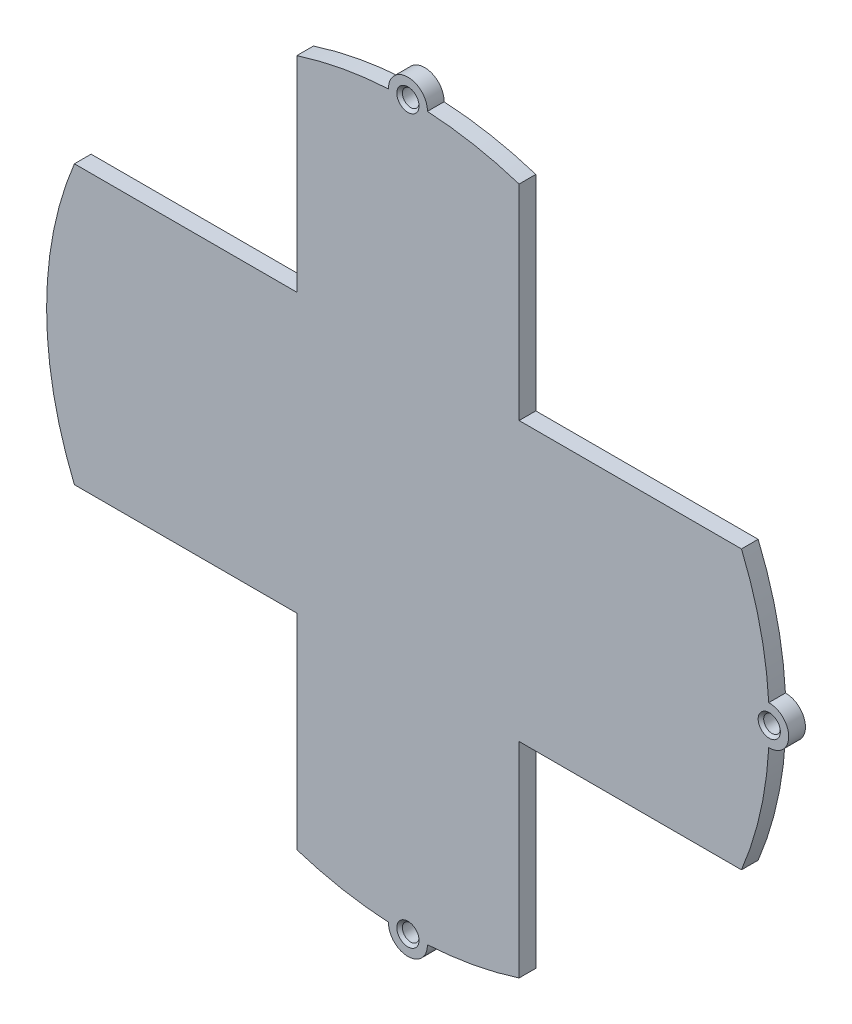
ISO-10303-21;
HEADER;
FILE_DESCRIPTION(('STEP AP214'),'2;1');
FILE_NAME('part.step','',(''),(''),'','','');
FILE_SCHEMA(('AUTOMOTIVE_DESIGN { 1 0 10303 214 1 1 1 1 }'));
ENDSEC;
DATA;
#1=APPLICATION_CONTEXT('core data for automotive mechanical design processes');
#2=APPLICATION_PROTOCOL_DEFINITION('international standard','automotive_design',2000,#1);
#3=PRODUCT_CONTEXT('',#1,'mechanical');
#4=PRODUCT('Part','Part','',(#3));
#5=PRODUCT_RELATED_PRODUCT_CATEGORY('part','',(#4));
#6=PRODUCT_DEFINITION_FORMATION('','',#4);
#7=PRODUCT_DEFINITION_CONTEXT('part definition',#1,'design');
#8=PRODUCT_DEFINITION('design','',#6,#7);
#9=PRODUCT_DEFINITION_SHAPE('','',#8);
#10=(LENGTH_UNIT() NAMED_UNIT(*) SI_UNIT(.MILLI.,.METRE.));
#11=(NAMED_UNIT(*) PLANE_ANGLE_UNIT() SI_UNIT($,.RADIAN.));
#12=(NAMED_UNIT(*) SI_UNIT($,.STERADIAN.) SOLID_ANGLE_UNIT());
#13=UNCERTAINTY_MEASURE_WITH_UNIT(LENGTH_MEASURE(1.E-05),#10,'distance_accuracy_value','');
#14=(GEOMETRIC_REPRESENTATION_CONTEXT(3) GLOBAL_UNCERTAINTY_ASSIGNED_CONTEXT((#13)) GLOBAL_UNIT_ASSIGNED_CONTEXT((#10,
#11,#12)) REPRESENTATION_CONTEXT('',''));
#15=CARTESIAN_POINT('',(0.,0.,0.));
#16=DIRECTION('',(0.,0.,1.));
#17=DIRECTION('',(1.,0.,0.));
#18=AXIS2_PLACEMENT_3D('',#15,#16,#17);
#19=CARTESIAN_POINT('',(0.,0.,3.));
#20=DIRECTION('',(0.,0.,-1.));
#21=DIRECTION('',(-1.,0.,0.));
#22=AXIS2_PLACEMENT_3D('',#19,#20,#21);
#23=CYLINDRICAL_SURFACE('',#22,65.);
#24=CARTESIAN_POINT('',(0.,0.,0.));
#25=DIRECTION('',(0.,0.,1.));
#26=DIRECTION('',(1.,0.,0.));
#27=AXIS2_PLACEMENT_3D('',#24,#25,#26);
#28=CIRCLE('',#27,65.);
#29=CARTESIAN_POINT('',(-20.,-61.8465843842649,0.));
#30=VERTEX_POINT('',#29);
#31=CARTESIAN_POINT('',(-3.4987312789253,-64.9057692307692,0.));
#32=VERTEX_POINT('',#31);
#33=EDGE_CURVE('E184',#30,#32,#28,.T.);
#34=ORIENTED_EDGE('',*,*,#33,.T.);
#35=DIRECTION('',(0.,0.,1.));
#36=VECTOR('',#35,1.);
#37=CARTESIAN_POINT('',(-3.4987312789253,-64.9057692307692,1.5));
#38=LINE('',#37,#36);
#39=CARTESIAN_POINT('',(-3.4987312789253,-64.9057692307692,3.));
#40=VERTEX_POINT('',#39);
#41=EDGE_CURVE('E167',#32,#40,#38,.T.);
#42=ORIENTED_EDGE('',*,*,#41,.T.);
#43=CARTESIAN_POINT('',(0.,0.,3.));
#44=DIRECTION('',(0.,0.,1.));
#45=DIRECTION('',(1.,0.,0.));
#46=AXIS2_PLACEMENT_3D('',#43,#44,#45);
#47=CIRCLE('',#46,65.);
#48=CARTESIAN_POINT('',(-20.,-61.8465843842649,3.));
#49=VERTEX_POINT('',#48);
#50=EDGE_CURVE('E355',#49,#40,#47,.T.);
#51=ORIENTED_EDGE('',*,*,#50,.F.);
#52=DIRECTION('',(0.,0.,-1.));
#53=VECTOR('',#52,1.);
#54=CARTESIAN_POINT('',(-20.,-61.8465843842649,3.));
#55=LINE('',#54,#53);
#56=EDGE_CURVE('E238',#49,#30,#55,.T.);
#57=ORIENTED_EDGE('',*,*,#56,.T.);
#58=EDGE_LOOP('',(#34,#42,#51,#57));
#59=FACE_BOUND('',#58,.T.);
#60=ADVANCED_FACE('F37',(#59),#23,.T.);
#61=CARTESIAN_POINT('',(0.,0.,3.));
#62=DIRECTION('',(0.,0.,-1.));
#63=DIRECTION('',(-1.,0.,0.));
#64=AXIS2_PLACEMENT_3D('',#61,#62,#63);
#65=CYLINDRICAL_SURFACE('',#64,65.);
#66=CARTESIAN_POINT('',(0.,0.,0.));
#67=DIRECTION('',(0.,0.,1.));
#68=DIRECTION('',(1.,0.,0.));
#69=AXIS2_PLACEMENT_3D('',#66,#67,#68);
#70=CIRCLE('',#69,65.);
#71=CARTESIAN_POINT('',(20.,61.8465843842649,0.));
#72=VERTEX_POINT('',#71);
#73=CARTESIAN_POINT('',(3.49873127892529,64.9057692307692,0.));
#74=VERTEX_POINT('',#73);
#75=EDGE_CURVE('E203',#72,#74,#70,.T.);
#76=ORIENTED_EDGE('',*,*,#75,.T.);
#77=DIRECTION('',(0.,0.,1.));
#78=VECTOR('',#77,1.);
#79=CARTESIAN_POINT('',(3.49873127892529,64.9057692307692,1.5));
#80=LINE('',#79,#78);
#81=CARTESIAN_POINT('',(3.49873127892529,64.9057692307692,3.));
#82=VERTEX_POINT('',#81);
#83=EDGE_CURVE('E368',#74,#82,#80,.T.);
#84=ORIENTED_EDGE('',*,*,#83,.T.);
#85=CARTESIAN_POINT('',(0.,0.,3.));
#86=DIRECTION('',(0.,0.,1.));
#87=DIRECTION('',(1.,0.,0.));
#88=AXIS2_PLACEMENT_3D('',#85,#86,#87);
#89=CIRCLE('',#88,65.);
#90=CARTESIAN_POINT('',(20.,61.8465843842649,3.));
#91=VERTEX_POINT('',#90);
#92=EDGE_CURVE('E340',#91,#82,#89,.T.);
#93=ORIENTED_EDGE('',*,*,#92,.F.);
#94=DIRECTION('',(0.,0.,-1.));
#95=VECTOR('',#94,1.);
#96=CARTESIAN_POINT('',(20.,61.8465843842649,3.));
#97=LINE('',#96,#95);
#98=EDGE_CURVE('E221',#91,#72,#97,.T.);
#99=ORIENTED_EDGE('',*,*,#98,.T.);
#100=EDGE_LOOP('',(#76,#84,#93,#99));
#101=FACE_BOUND('',#100,.T.);
#102=ADVANCED_FACE('F279',(#101),#65,.T.);
#103=CARTESIAN_POINT('',(0.,0.,3.));
#104=DIRECTION('',(0.,0.,-1.));
#105=DIRECTION('',(-1.,0.,0.));
#106=AXIS2_PLACEMENT_3D('',#103,#104,#105);
#107=CYLINDRICAL_SURFACE('',#106,65.);
#108=CARTESIAN_POINT('',(0.,0.,0.));
#109=DIRECTION('',(0.,0.,1.));
#110=DIRECTION('',(1.,0.,0.));
#111=AXIS2_PLACEMENT_3D('',#108,#109,#110);
#112=CIRCLE('',#111,65.);
#113=CARTESIAN_POINT('',(60.,-25.,0.));
#114=VERTEX_POINT('',#113);
#115=CARTESIAN_POINT('',(64.9057692307692,-3.49873127892529,0.));
#116=VERTEX_POINT('',#115);
#117=EDGE_CURVE('E195',#114,#116,#112,.T.);
#118=ORIENTED_EDGE('',*,*,#117,.T.);
#119=DIRECTION('',(0.,0.,1.));
#120=VECTOR('',#119,1.);
#121=CARTESIAN_POINT('',(64.9057692307692,-3.49873127892529,1.5));
#122=LINE('',#121,#120);
#123=CARTESIAN_POINT('',(64.9057692307692,-3.49873127892529,3.));
#124=VERTEX_POINT('',#123);
#125=EDGE_CURVE('E331',#116,#124,#122,.T.);
#126=ORIENTED_EDGE('',*,*,#125,.T.);
#127=CARTESIAN_POINT('',(0.,0.,3.));
#128=DIRECTION('',(0.,0.,1.));
#129=DIRECTION('',(1.,0.,0.));
#130=AXIS2_PLACEMENT_3D('',#127,#128,#129);
#131=CIRCLE('',#130,65.);
#132=CARTESIAN_POINT('',(60.,-25.,3.));
#133=VERTEX_POINT('',#132);
#134=EDGE_CURVE('E347',#133,#124,#131,.T.);
#135=ORIENTED_EDGE('',*,*,#134,.F.);
#136=DIRECTION('',(0.,0.,-1.));
#137=VECTOR('',#136,1.);
#138=CARTESIAN_POINT('',(60.,-25.,3.));
#139=LINE('',#138,#137);
#140=EDGE_CURVE('E230',#133,#114,#139,.T.);
#141=ORIENTED_EDGE('',*,*,#140,.T.);
#142=EDGE_LOOP('',(#118,#126,#135,#141));
#143=FACE_BOUND('',#142,.T.);
#144=ADVANCED_FACE('F285',(#143),#107,.T.);
#145=CARTESIAN_POINT('',(0.,0.,3.));
#146=DIRECTION('',(0.,0.,-1.));
#147=DIRECTION('',(-1.,0.,0.));
#148=AXIS2_PLACEMENT_3D('',#145,#146,#147);
#149=CYLINDRICAL_SURFACE('',#148,65.);
#150=CARTESIAN_POINT('',(0.,0.,0.));
#151=DIRECTION('',(0.,0.,1.));
#152=DIRECTION('',(1.,0.,0.));
#153=AXIS2_PLACEMENT_3D('',#150,#151,#152);
#154=CIRCLE('',#153,65.);
#155=CARTESIAN_POINT('',(-60.,25.,0.));
#156=VERTEX_POINT('',#155);
#157=CARTESIAN_POINT('',(-60.,-25.,0.));
#158=VERTEX_POINT('',#157);
#159=EDGE_CURVE('E327',#156,#158,#154,.T.);
#160=ORIENTED_EDGE('',*,*,#159,.T.);
#161=DIRECTION('',(0.,0.,-1.));
#162=VECTOR('',#161,1.);
#163=CARTESIAN_POINT('',(-60.,-25.,3.));
#164=LINE('',#163,#162);
#165=CARTESIAN_POINT('',(-60.,-25.,3.));
#166=VERTEX_POINT('',#165);
#167=EDGE_CURVE('E244',#166,#158,#164,.T.);
#168=ORIENTED_EDGE('',*,*,#167,.F.);
#169=CARTESIAN_POINT('',(0.,0.,3.));
#170=DIRECTION('',(0.,0.,1.));
#171=DIRECTION('',(1.,0.,0.));
#172=AXIS2_PLACEMENT_3D('',#169,#170,#171);
#173=CIRCLE('',#172,65.);
#174=CARTESIAN_POINT('',(-60.,25.,3.));
#175=VERTEX_POINT('',#174);
#176=EDGE_CURVE('E210',#175,#166,#173,.T.);
#177=ORIENTED_EDGE('',*,*,#176,.F.);
#178=DIRECTION('',(0.,0.,-1.));
#179=VECTOR('',#178,1.);
#180=CARTESIAN_POINT('',(-60.,25.,3.));
#181=LINE('',#180,#179);
#182=EDGE_CURVE('E211',#175,#156,#181,.T.);
#183=ORIENTED_EDGE('',*,*,#182,.T.);
#184=EDGE_LOOP('',(#160,#168,#177,#183));
#185=FACE_BOUND('',#184,.T.);
#186=ADVANCED_FACE('F305',(#185),#149,.T.);
#187=CARTESIAN_POINT('',(-60.,-25.,3.));
#188=DIRECTION('',(0.,1.,0.));
#189=DIRECTION('',(0.,0.,1.));
#190=AXIS2_PLACEMENT_3D('',#187,#188,#189);
#191=PLANE('',#190);
#192=DIRECTION('',(1.,0.,0.));
#193=VECTOR('',#192,1.);
#194=CARTESIAN_POINT('',(-60.,-25.,0.));
#195=LINE('',#194,#193);
#196=CARTESIAN_POINT('',(-20.,-25.,0.));
#197=VERTEX_POINT('',#196);
#198=EDGE_CURVE('E187',#158,#197,#195,.T.);
#199=ORIENTED_EDGE('',*,*,#198,.T.);
#200=DIRECTION('',(0.,0.,-1.));
#201=VECTOR('',#200,1.);
#202=CARTESIAN_POINT('',(-20.,-25.,3.));
#203=LINE('',#202,#201);
#204=CARTESIAN_POINT('',(-20.,-25.,3.));
#205=VERTEX_POINT('',#204);
#206=EDGE_CURVE('E241',#205,#197,#203,.T.);
#207=ORIENTED_EDGE('',*,*,#206,.F.);
#208=DIRECTION('',(1.,0.,0.));
#209=VECTOR('',#208,1.);
#210=CARTESIAN_POINT('',(-60.,-25.,3.));
#211=LINE('',#210,#209);
#212=EDGE_CURVE('E359',#166,#205,#211,.T.);
#213=ORIENTED_EDGE('',*,*,#212,.F.);
#214=ORIENTED_EDGE('',*,*,#167,.T.);
#215=EDGE_LOOP('',(#199,#207,#213,#214));
#216=FACE_BOUND('',#215,.T.);
#217=ADVANCED_FACE('F300',(#216),#191,.F.);
#218=CARTESIAN_POINT('',(-20.,-25.,3.));
#219=DIRECTION('',(1.,0.,0.));
#220=DIRECTION('',(0.,0.,-1.));
#221=AXIS2_PLACEMENT_3D('',#218,#219,#220);
#222=PLANE('',#221);
#223=DIRECTION('',(0.,-1.,0.));
#224=VECTOR('',#223,1.);
#225=CARTESIAN_POINT('',(-20.,-25.,0.));
#226=LINE('',#225,#224);
#227=EDGE_CURVE('E185',#197,#30,#226,.T.);
#228=ORIENTED_EDGE('',*,*,#227,.T.);
#229=ORIENTED_EDGE('',*,*,#56,.F.);
#230=DIRECTION('',(0.,-1.,0.));
#231=VECTOR('',#230,1.);
#232=CARTESIAN_POINT('',(-20.,-25.,3.));
#233=LINE('',#232,#231);
#234=EDGE_CURVE('E357',#205,#49,#233,.T.);
#235=ORIENTED_EDGE('',*,*,#234,.F.);
#236=ORIENTED_EDGE('',*,*,#206,.T.);
#237=EDGE_LOOP('',(#228,#229,#235,#236));
#238=FACE_BOUND('',#237,.T.);
#239=ADVANCED_FACE('F293',(#238),#222,.F.);
#240=CARTESIAN_POINT('',(3.49873127892516,-64.9057692307692,3.));
#241=VERTEX_POINT('',#240);
#242=CARTESIAN_POINT('',(20.,-61.8465843842649,3.));
#243=VERTEX_POINT('',#242);
#244=EDGE_CURVE('E178',#241,#243,#47,.T.);
#245=ORIENTED_EDGE('',*,*,#244,.F.);
#246=DIRECTION('',(0.,0.,1.));
#247=VECTOR('',#246,1.);
#248=CARTESIAN_POINT('',(3.49873127892528,-64.9057692307692,1.5));
#249=LINE('',#248,#247);
#250=CARTESIAN_POINT('',(3.49873127892528,-64.9057692307692,0.));
#251=VERTEX_POINT('',#250);
#252=EDGE_CURVE('E164',#241,#251,#249,.F.);
#253=ORIENTED_EDGE('',*,*,#252,.T.);
#254=CARTESIAN_POINT('',(20.,-61.8465843842649,0.));
#255=VERTEX_POINT('',#254);
#256=EDGE_CURVE('E176',#251,#255,#28,.T.);
#257=ORIENTED_EDGE('',*,*,#256,.T.);
#258=DIRECTION('',(0.,0.,-1.));
#259=VECTOR('',#258,1.);
#260=CARTESIAN_POINT('',(20.,-61.8465843842649,3.));
#261=LINE('',#260,#259);
#262=EDGE_CURVE('E236',#243,#255,#261,.T.);
#263=ORIENTED_EDGE('',*,*,#262,.F.);
#264=EDGE_LOOP('',(#245,#253,#257,#263));
#265=FACE_BOUND('',#264,.T.);
#266=ADVANCED_FACE('F174',(#265),#23,.T.);
#267=CARTESIAN_POINT('',(20.,-25.,3.));
#268=DIRECTION('',(-1.,0.,0.));
#269=DIRECTION('',(0.,-1.,0.));
#270=AXIS2_PLACEMENT_3D('',#267,#268,#269);
#271=PLANE('',#270);
#272=DIRECTION('',(0.,1.,0.));
#273=VECTOR('',#272,1.);
#274=CARTESIAN_POINT('',(20.,-25.,0.));
#275=LINE('',#274,#273);
#276=CARTESIAN_POINT('',(20.,-25.,0.));
#277=VERTEX_POINT('',#276);
#278=EDGE_CURVE('E183',#255,#277,#275,.T.);
#279=ORIENTED_EDGE('',*,*,#278,.T.);
#280=DIRECTION('',(0.,0.,-1.));
#281=VECTOR('',#280,1.);
#282=CARTESIAN_POINT('',(20.,-25.,3.));
#283=LINE('',#282,#281);
#284=CARTESIAN_POINT('',(20.,-25.,3.));
#285=VERTEX_POINT('',#284);
#286=EDGE_CURVE('E233',#285,#277,#283,.T.);
#287=ORIENTED_EDGE('',*,*,#286,.F.);
#288=DIRECTION('',(0.,1.,0.));
#289=VECTOR('',#288,1.);
#290=CARTESIAN_POINT('',(20.,-25.,3.));
#291=LINE('',#290,#289);
#292=EDGE_CURVE('E353',#243,#285,#291,.T.);
#293=ORIENTED_EDGE('',*,*,#292,.F.);
#294=ORIENTED_EDGE('',*,*,#262,.T.);
#295=EDGE_LOOP('',(#279,#287,#293,#294));
#296=FACE_BOUND('',#295,.T.);
#297=ADVANCED_FACE('F292',(#296),#271,.F.);
#298=CARTESIAN_POINT('',(20.,-25.,3.));
#299=DIRECTION('',(0.,1.,0.));
#300=DIRECTION('',(0.,0.,1.));
#301=AXIS2_PLACEMENT_3D('',#298,#299,#300);
#302=PLANE('',#301);
#303=DIRECTION('',(1.,0.,0.));
#304=VECTOR('',#303,1.);
#305=CARTESIAN_POINT('',(20.,-25.,0.));
#306=LINE('',#305,#304);
#307=EDGE_CURVE('E192',#277,#114,#306,.T.);
#308=ORIENTED_EDGE('',*,*,#307,.T.);
#309=ORIENTED_EDGE('',*,*,#140,.F.);
#310=DIRECTION('',(1.,0.,0.));
#311=VECTOR('',#310,1.);
#312=CARTESIAN_POINT('',(20.,-25.,3.));
#313=LINE('',#312,#311);
#314=EDGE_CURVE('E351',#285,#133,#313,.T.);
#315=ORIENTED_EDGE('',*,*,#314,.F.);
#316=ORIENTED_EDGE('',*,*,#286,.T.);
#317=EDGE_LOOP('',(#308,#309,#315,#316));
#318=FACE_BOUND('',#317,.T.);
#319=ADVANCED_FACE('F298',(#318),#302,.F.);
#320=CARTESIAN_POINT('',(64.9057692307692,3.49873127892542,3.));
#321=VERTEX_POINT('',#320);
#322=CARTESIAN_POINT('',(60.,25.,3.));
#323=VERTEX_POINT('',#322);
#324=EDGE_CURVE('E350',#321,#323,#131,.T.);
#325=ORIENTED_EDGE('',*,*,#324,.F.);
#326=DIRECTION('',(0.,0.,1.));
#327=VECTOR('',#326,1.);
#328=CARTESIAN_POINT('',(64.9057692307692,3.49873127892529,1.5));
#329=LINE('',#328,#327);
#330=CARTESIAN_POINT('',(64.9057692307692,3.49873127892529,0.));
#331=VERTEX_POINT('',#330);
#332=EDGE_CURVE('E334',#321,#331,#329,.F.);
#333=ORIENTED_EDGE('',*,*,#332,.T.);
#334=CARTESIAN_POINT('',(60.,25.,0.));
#335=VERTEX_POINT('',#334);
#336=EDGE_CURVE('E194',#331,#335,#112,.T.);
#337=ORIENTED_EDGE('',*,*,#336,.T.);
#338=DIRECTION('',(0.,0.,-1.));
#339=VECTOR('',#338,1.);
#340=CARTESIAN_POINT('',(60.,25.,3.));
#341=LINE('',#340,#339);
#342=EDGE_CURVE('E227',#323,#335,#341,.T.);
#343=ORIENTED_EDGE('',*,*,#342,.F.);
#344=EDGE_LOOP('',(#325,#333,#337,#343));
#345=FACE_BOUND('',#344,.T.);
#346=ADVANCED_FACE('F323',(#345),#107,.T.);
#347=CARTESIAN_POINT('',(20.,25.,3.));
#348=DIRECTION('',(0.,-1.,0.));
#349=DIRECTION('',(1.,0.,0.));
#350=AXIS2_PLACEMENT_3D('',#347,#348,#349);
#351=PLANE('',#350);
#352=DIRECTION('',(-1.,0.,0.));
#353=VECTOR('',#352,1.);
#354=CARTESIAN_POINT('',(20.,25.,0.));
#355=LINE('',#354,#353);
#356=CARTESIAN_POINT('',(20.,25.,0.));
#357=VERTEX_POINT('',#356);
#358=EDGE_CURVE('E198',#335,#357,#355,.T.);
#359=ORIENTED_EDGE('',*,*,#358,.T.);
#360=DIRECTION('',(0.,0.,-1.));
#361=VECTOR('',#360,1.);
#362=CARTESIAN_POINT('',(20.,25.,3.));
#363=LINE('',#362,#361);
#364=CARTESIAN_POINT('',(20.,25.,3.));
#365=VERTEX_POINT('',#364);
#366=EDGE_CURVE('E224',#365,#357,#363,.T.);
#367=ORIENTED_EDGE('',*,*,#366,.F.);
#368=DIRECTION('',(-1.,0.,0.));
#369=VECTOR('',#368,1.);
#370=CARTESIAN_POINT('',(20.,25.,3.));
#371=LINE('',#370,#369);
#372=EDGE_CURVE('E345',#323,#365,#371,.T.);
#373=ORIENTED_EDGE('',*,*,#372,.F.);
#374=ORIENTED_EDGE('',*,*,#342,.T.);
#375=EDGE_LOOP('',(#359,#367,#373,#374));
#376=FACE_BOUND('',#375,.T.);
#377=ADVANCED_FACE('F433',(#376),#351,.F.);
#378=CARTESIAN_POINT('',(20.,61.8465843842649,3.));
#379=DIRECTION('',(-1.,0.,0.));
#380=DIRECTION('',(0.,-1.,0.));
#381=AXIS2_PLACEMENT_3D('',#378,#379,#380);
#382=PLANE('',#381);
#383=DIRECTION('',(0.,1.,0.));
#384=VECTOR('',#383,1.);
#385=CARTESIAN_POINT('',(20.,61.8465843842649,0.));
#386=LINE('',#385,#384);
#387=EDGE_CURVE('E200',#357,#72,#386,.T.);
#388=ORIENTED_EDGE('',*,*,#387,.T.);
#389=ORIENTED_EDGE('',*,*,#98,.F.);
#390=DIRECTION('',(0.,1.,0.));
#391=VECTOR('',#390,1.);
#392=CARTESIAN_POINT('',(20.,61.8465843842649,3.));
#393=LINE('',#392,#391);
#394=EDGE_CURVE('E343',#365,#91,#393,.T.);
#395=ORIENTED_EDGE('',*,*,#394,.F.);
#396=ORIENTED_EDGE('',*,*,#366,.T.);
#397=EDGE_LOOP('',(#388,#389,#395,#396));
#398=FACE_BOUND('',#397,.T.);
#399=ADVANCED_FACE('F429',(#398),#382,.F.);
#400=CARTESIAN_POINT('',(-3.49873127892517,64.9057692307692,3.));
#401=VERTEX_POINT('',#400);
#402=CARTESIAN_POINT('',(-20.,61.8465843842649,3.));
#403=VERTEX_POINT('',#402);
#404=EDGE_CURVE('E342',#401,#403,#89,.T.);
#405=ORIENTED_EDGE('',*,*,#404,.F.);
#406=DIRECTION('',(0.,0.,1.));
#407=VECTOR('',#406,1.);
#408=CARTESIAN_POINT('',(-3.49873127892528,64.9057692307692,1.5));
#409=LINE('',#408,#407);
#410=CARTESIAN_POINT('',(-3.49873127892528,64.9057692307692,0.));
#411=VERTEX_POINT('',#410);
#412=EDGE_CURVE('E372',#401,#411,#409,.F.);
#413=ORIENTED_EDGE('',*,*,#412,.T.);
#414=CARTESIAN_POINT('',(-20.,61.8465843842649,0.));
#415=VERTEX_POINT('',#414);
#416=EDGE_CURVE('E202',#411,#415,#70,.T.);
#417=ORIENTED_EDGE('',*,*,#416,.T.);
#418=DIRECTION('',(0.,0.,-1.));
#419=VECTOR('',#418,1.);
#420=CARTESIAN_POINT('',(-20.,61.8465843842649,3.));
#421=LINE('',#420,#419);
#422=EDGE_CURVE('E218',#403,#415,#421,.T.);
#423=ORIENTED_EDGE('',*,*,#422,.F.);
#424=EDGE_LOOP('',(#405,#413,#417,#423));
#425=FACE_BOUND('',#424,.T.);
#426=ADVANCED_FACE('F288',(#425),#65,.T.);
#427=CARTESIAN_POINT('',(-20.,61.8465843842649,3.));
#428=DIRECTION('',(1.,0.,0.));
#429=DIRECTION('',(0.,1.,0.));
#430=AXIS2_PLACEMENT_3D('',#427,#428,#429);
#431=PLANE('',#430);
#432=DIRECTION('',(0.,-1.,0.));
#433=VECTOR('',#432,1.);
#434=CARTESIAN_POINT('',(-20.,61.8465843842649,0.));
#435=LINE('',#434,#433);
#436=CARTESIAN_POINT('',(-20.,25.,0.));
#437=VERTEX_POINT('',#436);
#438=EDGE_CURVE('E206',#415,#437,#435,.T.);
#439=ORIENTED_EDGE('',*,*,#438,.T.);
#440=DIRECTION('',(0.,0.,-1.));
#441=VECTOR('',#440,1.);
#442=CARTESIAN_POINT('',(-20.,25.,3.));
#443=LINE('',#442,#441);
#444=CARTESIAN_POINT('',(-20.,25.,3.));
#445=VERTEX_POINT('',#444);
#446=EDGE_CURVE('E214',#445,#437,#443,.T.);
#447=ORIENTED_EDGE('',*,*,#446,.F.);
#448=DIRECTION('',(0.,-1.,0.));
#449=VECTOR('',#448,1.);
#450=CARTESIAN_POINT('',(-20.,61.8465843842649,3.));
#451=LINE('',#450,#449);
#452=EDGE_CURVE('E338',#403,#445,#451,.T.);
#453=ORIENTED_EDGE('',*,*,#452,.F.);
#454=ORIENTED_EDGE('',*,*,#422,.T.);
#455=EDGE_LOOP('',(#439,#447,#453,#454));
#456=FACE_BOUND('',#455,.T.);
#457=ADVANCED_FACE('F423',(#456),#431,.F.);
#458=CARTESIAN_POINT('',(-60.,25.,3.));
#459=DIRECTION('',(0.,-1.,0.));
#460=DIRECTION('',(1.,0.,0.));
#461=AXIS2_PLACEMENT_3D('',#458,#459,#460);
#462=PLANE('',#461);
#463=DIRECTION('',(-1.,0.,0.));
#464=VECTOR('',#463,1.);
#465=CARTESIAN_POINT('',(-60.,25.,0.));
#466=LINE('',#465,#464);
#467=EDGE_CURVE('E208',#437,#156,#466,.T.);
#468=ORIENTED_EDGE('',*,*,#467,.T.);
#469=ORIENTED_EDGE('',*,*,#182,.F.);
#470=DIRECTION('',(-1.,0.,0.));
#471=VECTOR('',#470,1.);
#472=CARTESIAN_POINT('',(-60.,25.,3.));
#473=LINE('',#472,#471);
#474=EDGE_CURVE('E215',#445,#175,#473,.T.);
#475=ORIENTED_EDGE('',*,*,#474,.F.);
#476=ORIENTED_EDGE('',*,*,#446,.T.);
#477=EDGE_LOOP('',(#468,#469,#475,#476));
#478=FACE_BOUND('',#477,.T.);
#479=ADVANCED_FACE('F417',(#478),#462,.F.);
#480=CARTESIAN_POINT('',(0.,0.,3.));
#481=DIRECTION('',(0.,0.,1.));
#482=DIRECTION('',(1.,0.,0.));
#483=AXIS2_PLACEMENT_3D('',#480,#481,#482);
#484=PLANE('',#483);
#485=CARTESIAN_POINT('',(0.,65.,3.));
#486=DIRECTION('',(0.,0.,1.));
#487=DIRECTION('',(1.,0.,0.));
#488=AXIS2_PLACEMENT_3D('',#485,#486,#487);
#489=CIRCLE('',#488,2.);
#490=CARTESIAN_POINT('',(2.00000000000001,65.,3.));
#491=VERTEX_POINT('',#490);
#492=EDGE_CURVE('E256',#491,#491,#489,.F.);
#493=ORIENTED_EDGE('',*,*,#492,.T.);
#494=EDGE_LOOP('',(#493));
#495=FACE_BOUND('',#494,.T.);
#496=CARTESIAN_POINT('',(65.,0.,3.));
#497=DIRECTION('',(0.,0.,1.));
#498=DIRECTION('',(1.,0.,0.));
#499=AXIS2_PLACEMENT_3D('',#496,#497,#498);
#500=CIRCLE('',#499,2.00000000000003);
#501=CARTESIAN_POINT('',(67.,0.,3.));
#502=VERTEX_POINT('',#501);
#503=EDGE_CURVE('E253',#502,#502,#500,.F.);
#504=ORIENTED_EDGE('',*,*,#503,.T.);
#505=EDGE_LOOP('',(#504));
#506=FACE_BOUND('',#505,.T.);
#507=CARTESIAN_POINT('',(0.,-65.,3.));
#508=DIRECTION('',(0.,0.,1.));
#509=DIRECTION('',(1.,0.,0.));
#510=AXIS2_PLACEMENT_3D('',#507,#508,#509);
#511=CIRCLE('',#510,2.);
#512=CARTESIAN_POINT('',(1.99999999999999,-65.,3.));
#513=VERTEX_POINT('',#512);
#514=EDGE_CURVE('E250',#513,#513,#511,.F.);
#515=ORIENTED_EDGE('',*,*,#514,.T.);
#516=EDGE_LOOP('',(#515));
#517=FACE_BOUND('',#516,.T.);
#518=ORIENTED_EDGE('',*,*,#50,.T.);
#519=CARTESIAN_POINT('',(0.,-65.,3.));
#520=DIRECTION('',(0.,0.,1.));
#521=DIRECTION('',(1.,0.,0.));
#522=AXIS2_PLACEMENT_3D('',#519,#520,#521);
#523=CIRCLE('',#522,3.5);
#524=EDGE_CURVE('E53',#40,#241,#523,.T.);
#525=ORIENTED_EDGE('',*,*,#524,.T.);
#526=ORIENTED_EDGE('',*,*,#244,.T.);
#527=ORIENTED_EDGE('',*,*,#292,.T.);
#528=ORIENTED_EDGE('',*,*,#314,.T.);
#529=ORIENTED_EDGE('',*,*,#134,.T.);
#530=CARTESIAN_POINT('',(65.,0.,3.));
#531=DIRECTION('',(0.,0.,1.));
#532=DIRECTION('',(1.,0.,0.));
#533=AXIS2_PLACEMENT_3D('',#530,#531,#532);
#534=CIRCLE('',#533,3.50000000000001);
#535=EDGE_CURVE('E366',#124,#321,#534,.T.);
#536=ORIENTED_EDGE('',*,*,#535,.T.);
#537=ORIENTED_EDGE('',*,*,#324,.T.);
#538=ORIENTED_EDGE('',*,*,#372,.T.);
#539=ORIENTED_EDGE('',*,*,#394,.T.);
#540=ORIENTED_EDGE('',*,*,#92,.T.);
#541=CARTESIAN_POINT('',(0.,65.,3.));
#542=DIRECTION('',(0.,0.,1.));
#543=DIRECTION('',(1.,0.,0.));
#544=AXIS2_PLACEMENT_3D('',#541,#542,#543);
#545=CIRCLE('',#544,3.5);
#546=EDGE_CURVE('E60',#82,#401,#545,.T.);
#547=ORIENTED_EDGE('',*,*,#546,.T.);
#548=ORIENTED_EDGE('',*,*,#404,.T.);
#549=ORIENTED_EDGE('',*,*,#452,.T.);
#550=ORIENTED_EDGE('',*,*,#474,.T.);
#551=ORIENTED_EDGE('',*,*,#176,.T.);
#552=ORIENTED_EDGE('',*,*,#212,.T.);
#553=ORIENTED_EDGE('',*,*,#234,.T.);
#554=EDGE_LOOP('',(#518,#525,#526,#527,#528,#529,#536,#537,#538,#539,#540,#547,#548,#549,#550,
#551,#552,#553));
#555=FACE_BOUND('',#554,.T.);
#556=ADVANCED_FACE('F414',(#495,#506,#517,#555),#484,.T.);
#557=CARTESIAN_POINT('',(0.,0.,0.));
#558=DIRECTION('',(0.,0.,1.));
#559=DIRECTION('',(1.,0.,0.));
#560=AXIS2_PLACEMENT_3D('',#557,#558,#559);
#561=PLANE('',#560);
#562=CARTESIAN_POINT('',(0.,65.,0.));
#563=DIRECTION('',(0.,0.,1.));
#564=DIRECTION('',(1.,0.,0.));
#565=AXIS2_PLACEMENT_3D('',#562,#563,#564);
#566=CIRCLE('',#565,1.5);
#567=CARTESIAN_POINT('',(1.5,65.,0.));
#568=VERTEX_POINT('',#567);
#569=EDGE_CURVE('E379',#568,#568,#566,.T.);
#570=ORIENTED_EDGE('',*,*,#569,.T.);
#571=EDGE_LOOP('',(#570));
#572=FACE_BOUND('',#571,.T.);
#573=CARTESIAN_POINT('',(65.,0.,0.));
#574=DIRECTION('',(0.,0.,1.));
#575=DIRECTION('',(1.,0.,0.));
#576=AXIS2_PLACEMENT_3D('',#573,#574,#575);
#577=CIRCLE('',#576,1.5);
#578=CARTESIAN_POINT('',(66.5,0.,0.));
#579=VERTEX_POINT('',#578);
#580=EDGE_CURVE('E384',#579,#579,#577,.T.);
#581=ORIENTED_EDGE('',*,*,#580,.T.);
#582=EDGE_LOOP('',(#581));
#583=FACE_BOUND('',#582,.T.);
#584=CARTESIAN_POINT('',(0.,-65.,0.));
#585=DIRECTION('',(0.,0.,1.));
#586=DIRECTION('',(1.,0.,0.));
#587=AXIS2_PLACEMENT_3D('',#584,#585,#586);
#588=CIRCLE('',#587,1.5);
#589=CARTESIAN_POINT('',(1.49999999999999,-65.,0.));
#590=VERTEX_POINT('',#589);
#591=EDGE_CURVE('E381',#590,#590,#588,.T.);
#592=ORIENTED_EDGE('',*,*,#591,.T.);
#593=EDGE_LOOP('',(#592));
#594=FACE_BOUND('',#593,.T.);
#595=ORIENTED_EDGE('',*,*,#256,.F.);
#596=CARTESIAN_POINT('',(0.,-65.,0.));
#597=DIRECTION('',(0.,0.,1.));
#598=DIRECTION('',(1.,0.,0.));
#599=AXIS2_PLACEMENT_3D('',#596,#597,#598);
#600=CIRCLE('',#599,3.5);
#601=EDGE_CURVE('E161',#32,#251,#600,.T.);
#602=ORIENTED_EDGE('',*,*,#601,.F.);
#603=ORIENTED_EDGE('',*,*,#33,.F.);
#604=ORIENTED_EDGE('',*,*,#227,.F.);
#605=ORIENTED_EDGE('',*,*,#198,.F.);
#606=ORIENTED_EDGE('',*,*,#159,.F.);
#607=ORIENTED_EDGE('',*,*,#467,.F.);
#608=ORIENTED_EDGE('',*,*,#438,.F.);
#609=ORIENTED_EDGE('',*,*,#416,.F.);
#610=CARTESIAN_POINT('',(0.,65.,0.));
#611=DIRECTION('',(0.,0.,1.));
#612=DIRECTION('',(1.,0.,0.));
#613=AXIS2_PLACEMENT_3D('',#610,#611,#612);
#614=CIRCLE('',#613,3.5);
#615=EDGE_CURVE('E375',#74,#411,#614,.T.);
#616=ORIENTED_EDGE('',*,*,#615,.F.);
#617=ORIENTED_EDGE('',*,*,#75,.F.);
#618=ORIENTED_EDGE('',*,*,#387,.F.);
#619=ORIENTED_EDGE('',*,*,#358,.F.);
#620=ORIENTED_EDGE('',*,*,#336,.F.);
#621=CARTESIAN_POINT('',(65.,0.,0.));
#622=DIRECTION('',(0.,0.,1.));
#623=DIRECTION('',(1.,0.,0.));
#624=AXIS2_PLACEMENT_3D('',#621,#622,#623);
#625=CIRCLE('',#624,3.50000000000001);
#626=EDGE_CURVE('E365',#116,#331,#625,.T.);
#627=ORIENTED_EDGE('',*,*,#626,.F.);
#628=ORIENTED_EDGE('',*,*,#117,.F.);
#629=ORIENTED_EDGE('',*,*,#307,.F.);
#630=ORIENTED_EDGE('',*,*,#278,.F.);
#631=EDGE_LOOP('',(#595,#602,#603,#604,#605,#606,#607,#608,#609,#616,#617,#618,#619,#620,#627,
#628,#629,#630));
#632=FACE_BOUND('',#631,.T.);
#633=ADVANCED_FACE('F181',(#572,#583,#594,#632),#561,.F.);
#634=CARTESIAN_POINT('',(65.,0.,0.));
#635=DIRECTION('',(0.,0.,1.));
#636=DIRECTION('',(1.,0.,0.));
#637=AXIS2_PLACEMENT_3D('',#634,#635,#636);
#638=CYLINDRICAL_SURFACE('',#637,3.50000000000001);
#639=ORIENTED_EDGE('',*,*,#125,.F.);
#640=ORIENTED_EDGE('',*,*,#626,.T.);
#641=ORIENTED_EDGE('',*,*,#332,.F.);
#642=ORIENTED_EDGE('',*,*,#535,.F.);
#643=EDGE_LOOP('',(#639,#640,#641,#642));
#644=FACE_BOUND('',#643,.T.);
#645=ADVANCED_FACE('F409',(#644),#638,.T.);
#646=CARTESIAN_POINT('',(0.,65.,0.));
#647=DIRECTION('',(0.,0.,1.));
#648=DIRECTION('',(1.,0.,0.));
#649=AXIS2_PLACEMENT_3D('',#646,#647,#648);
#650=CYLINDRICAL_SURFACE('',#649,3.5);
#651=ORIENTED_EDGE('',*,*,#83,.F.);
#652=ORIENTED_EDGE('',*,*,#615,.T.);
#653=ORIENTED_EDGE('',*,*,#412,.F.);
#654=ORIENTED_EDGE('',*,*,#546,.F.);
#655=EDGE_LOOP('',(#651,#652,#653,#654));
#656=FACE_BOUND('',#655,.T.);
#657=ADVANCED_FACE('F406',(#656),#650,.T.);
#658=CARTESIAN_POINT('',(0.,-65.,0.));
#659=DIRECTION('',(0.,0.,1.));
#660=DIRECTION('',(1.,0.,0.));
#661=AXIS2_PLACEMENT_3D('',#658,#659,#660);
#662=CYLINDRICAL_SURFACE('',#661,3.5);
#663=ORIENTED_EDGE('',*,*,#41,.F.);
#664=ORIENTED_EDGE('',*,*,#601,.T.);
#665=ORIENTED_EDGE('',*,*,#252,.F.);
#666=ORIENTED_EDGE('',*,*,#524,.F.);
#667=EDGE_LOOP('',(#663,#664,#665,#666));
#668=FACE_BOUND('',#667,.T.);
#669=ADVANCED_FACE('F163',(#668),#662,.T.);
#670=CARTESIAN_POINT('',(0.,-65.,0.));
#671=DIRECTION('',(0.,0.,1.));
#672=DIRECTION('',(1.,0.,0.));
#673=AXIS2_PLACEMENT_3D('',#670,#671,#672);
#674=CYLINDRICAL_SURFACE('',#673,1.5);
#675=CARTESIAN_POINT('',(0.,-65.,2.50000000000002));
#676=DIRECTION('',(0.,0.,1.));
#677=DIRECTION('',(1.,0.,0.));
#678=AXIS2_PLACEMENT_3D('',#675,#676,#677);
#679=CIRCLE('',#678,1.5);
#680=CARTESIAN_POINT('',(1.49999999999999,-65.,2.50000000000002));
#681=VERTEX_POINT('',#680);
#682=EDGE_CURVE('E11',#681,#681,#679,.T.);
#683=ORIENTED_EDGE('',*,*,#682,.T.);
#684=EDGE_LOOP('',(#683));
#685=FACE_BOUND('',#684,.T.);
#686=ORIENTED_EDGE('',*,*,#591,.F.);
#687=EDGE_LOOP('',(#686));
#688=FACE_BOUND('',#687,.T.);
#689=ADVANCED_FACE('F398',(#685,#688),#674,.F.);
#690=CARTESIAN_POINT('',(65.,0.,0.));
#691=DIRECTION('',(0.,0.,1.));
#692=DIRECTION('',(1.,0.,0.));
#693=AXIS2_PLACEMENT_3D('',#690,#691,#692);
#694=CYLINDRICAL_SURFACE('',#693,1.5);
#695=CARTESIAN_POINT('',(65.,0.,2.49999999999999));
#696=DIRECTION('',(0.,0.,1.));
#697=DIRECTION('',(1.,0.,0.));
#698=AXIS2_PLACEMENT_3D('',#695,#696,#697);
#699=CIRCLE('',#698,1.5);
#700=CARTESIAN_POINT('',(66.5,0.,2.49999999999999));
#701=VERTEX_POINT('',#700);
#702=EDGE_CURVE('E46',#701,#701,#699,.T.);
#703=ORIENTED_EDGE('',*,*,#702,.T.);
#704=EDGE_LOOP('',(#703));
#705=FACE_BOUND('',#704,.T.);
#706=ORIENTED_EDGE('',*,*,#580,.F.);
#707=EDGE_LOOP('',(#706));
#708=FACE_BOUND('',#707,.T.);
#709=ADVANCED_FACE('F261',(#705,#708),#694,.F.);
#710=CARTESIAN_POINT('',(0.,65.,0.));
#711=DIRECTION('',(0.,0.,1.));
#712=DIRECTION('',(1.,0.,0.));
#713=AXIS2_PLACEMENT_3D('',#710,#711,#712);
#714=CYLINDRICAL_SURFACE('',#713,1.5);
#715=CARTESIAN_POINT('',(0.,65.,2.50000000000002));
#716=DIRECTION('',(0.,0.,1.));
#717=DIRECTION('',(1.,0.,0.));
#718=AXIS2_PLACEMENT_3D('',#715,#716,#717);
#719=CIRCLE('',#718,1.5);
#720=CARTESIAN_POINT('',(1.5,65.,2.50000000000002));
#721=VERTEX_POINT('',#720);
#722=EDGE_CURVE('E247',#721,#721,#719,.T.);
#723=ORIENTED_EDGE('',*,*,#722,.T.);
#724=EDGE_LOOP('',(#723));
#725=FACE_BOUND('',#724,.T.);
#726=ORIENTED_EDGE('',*,*,#569,.F.);
#727=EDGE_LOOP('',(#726));
#728=FACE_BOUND('',#727,.T.);
#729=ADVANCED_FACE('F273',(#725,#728),#714,.F.);
#730=CARTESIAN_POINT('',(0.,65.,2.50000000000002));
#731=DIRECTION('',(0.,0.,1.));
#732=DIRECTION('',(1.,0.,0.));
#733=AXIS2_PLACEMENT_3D('',#730,#731,#732);
#734=CONICAL_SURFACE('',#733,1.5,0.785398163397471);
#735=ORIENTED_EDGE('',*,*,#492,.F.);
#736=EDGE_LOOP('',(#735));
#737=FACE_BOUND('',#736,.T.);
#738=ORIENTED_EDGE('',*,*,#722,.F.);
#739=EDGE_LOOP('',(#738));
#740=FACE_BOUND('',#739,.T.);
#741=ADVANCED_FACE('F266',(#737,#740),#734,.F.);
#742=CARTESIAN_POINT('',(65.,0.,2.49999999999999));
#743=DIRECTION('',(0.,0.,1.));
#744=DIRECTION('',(1.,0.,0.));
#745=AXIS2_PLACEMENT_3D('',#742,#743,#744);
#746=CONICAL_SURFACE('',#745,1.5,0.78539816339747);
#747=ORIENTED_EDGE('',*,*,#503,.F.);
#748=EDGE_LOOP('',(#747));
#749=FACE_BOUND('',#748,.T.);
#750=ORIENTED_EDGE('',*,*,#702,.F.);
#751=EDGE_LOOP('',(#750));
#752=FACE_BOUND('',#751,.T.);
#753=ADVANCED_FACE('F264',(#749,#752),#746,.F.);
#754=CARTESIAN_POINT('',(0.,-65.,2.50000000000002));
#755=DIRECTION('',(0.,0.,1.));
#756=DIRECTION('',(1.,0.,0.));
#757=AXIS2_PLACEMENT_3D('',#754,#755,#756);
#758=CONICAL_SURFACE('',#757,1.5,0.785398163397471);
#759=ORIENTED_EDGE('',*,*,#514,.F.);
#760=EDGE_LOOP('',(#759));
#761=FACE_BOUND('',#760,.T.);
#762=ORIENTED_EDGE('',*,*,#682,.F.);
#763=EDGE_LOOP('',(#762));
#764=FACE_BOUND('',#763,.T.);
#765=ADVANCED_FACE('F40',(#761,#764),#758,.F.);
#766=CLOSED_SHELL('',(#60,#102,#144,#186,#217,#239,#266,#297,#319,#346,#377,#399,#426,#457,#479,
#556,#633,#645,#657,#669,#689,#709,#729,#741,#753,#765));
#767=MANIFOLD_SOLID_BREP('B2',#766);
#768=ADVANCED_BREP_SHAPE_REPRESENTATION('',(#18,#767),#14);
#769=SHAPE_DEFINITION_REPRESENTATION(#9,#768);
ENDSEC;
END-ISO-10303-21;
